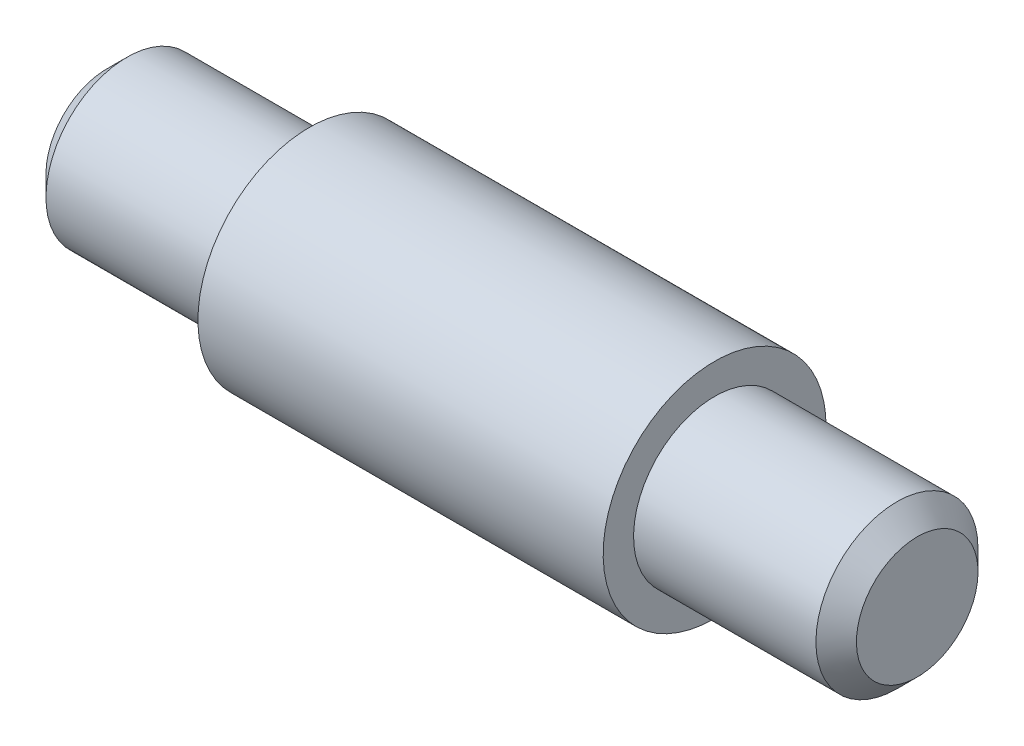
ISO-10303-21;
HEADER;
FILE_DESCRIPTION(('STEP AP214'),'2;1');
FILE_NAME('part.step','',(''),(''),'','','');
FILE_SCHEMA(('AUTOMOTIVE_DESIGN { 1 0 10303 214 1 1 1 1 }'));
ENDSEC;
DATA;
#1=APPLICATION_CONTEXT('core data for automotive mechanical design processes');
#2=APPLICATION_PROTOCOL_DEFINITION('international standard','automotive_design',2000,#1);
#3=PRODUCT_CONTEXT('',#1,'mechanical');
#4=PRODUCT('Part','Part','',(#3));
#5=PRODUCT_RELATED_PRODUCT_CATEGORY('part','',(#4));
#6=PRODUCT_DEFINITION_FORMATION('','',#4);
#7=PRODUCT_DEFINITION_CONTEXT('part definition',#1,'design');
#8=PRODUCT_DEFINITION('design','',#6,#7);
#9=PRODUCT_DEFINITION_SHAPE('','',#8);
#10=(LENGTH_UNIT() NAMED_UNIT(*) SI_UNIT(.MILLI.,.METRE.));
#11=(NAMED_UNIT(*) PLANE_ANGLE_UNIT() SI_UNIT($,.RADIAN.));
#12=(NAMED_UNIT(*) SI_UNIT($,.STERADIAN.) SOLID_ANGLE_UNIT());
#13=UNCERTAINTY_MEASURE_WITH_UNIT(LENGTH_MEASURE(1.E-05),#10,'distance_accuracy_value','');
#14=(GEOMETRIC_REPRESENTATION_CONTEXT(3) GLOBAL_UNCERTAINTY_ASSIGNED_CONTEXT((#13)) GLOBAL_UNIT_ASSIGNED_CONTEXT((#10,
#11,#12)) REPRESENTATION_CONTEXT('',''));
#15=CARTESIAN_POINT('',(0.,0.,0.));
#16=DIRECTION('',(0.,0.,1.));
#17=DIRECTION('',(1.,0.,0.));
#18=AXIS2_PLACEMENT_3D('',#15,#16,#17);
#19=CARTESIAN_POINT('',(39.9999999999997,0.,0.));
#20=DIRECTION('',(1.,0.,0.));
#21=DIRECTION('',(0.,1.,0.));
#22=AXIS2_PLACEMENT_3D('',#19,#20,#21);
#23=PLANE('',#22);
#24=CARTESIAN_POINT('',(39.9999999999997,0.,0.));
#25=DIRECTION('',(1.,0.,0.));
#26=DIRECTION('',(0.,1.,0.));
#27=AXIS2_PLACEMENT_3D('',#24,#25,#26);
#28=CIRCLE('',#27,5.99999999999995);
#29=CARTESIAN_POINT('',(39.9999999999997,5.99999999999998,0.));
#30=VERTEX_POINT('',#29);
#31=EDGE_CURVE('E44',#30,#30,#28,.T.);
#32=ORIENTED_EDGE('',*,*,#31,.T.);
#33=EDGE_LOOP('',(#32));
#34=FACE_BOUND('',#33,.T.);
#35=ADVANCED_FACE('F32',(#34),#23,.T.);
#36=CARTESIAN_POINT('',(-50.0000000000003,0.,0.));
#37=DIRECTION('',(-1.,0.,0.));
#38=DIRECTION('',(0.,-1.,0.));
#39=AXIS2_PLACEMENT_3D('',#36,#37,#38);
#40=CYLINDRICAL_SURFACE('',#39,8.00000000000001);
#41=CARTESIAN_POINT('',(37.9999999999997,0.,0.));
#42=DIRECTION('',(1.,0.,0.));
#43=DIRECTION('',(0.,1.,0.));
#44=AXIS2_PLACEMENT_3D('',#41,#42,#43);
#45=CIRCLE('',#44,8.00000000000001);
#46=CARTESIAN_POINT('',(37.9999999999997,8.00000000000003,0.));
#47=VERTEX_POINT('',#46);
#48=EDGE_CURVE('E48',#47,#47,#45,.F.);
#49=ORIENTED_EDGE('',*,*,#48,.T.);
#50=EDGE_LOOP('',(#49));
#51=FACE_BOUND('',#50,.T.);
#52=CARTESIAN_POINT('',(20.,-1.2490009027033E-13,0.));
#53=DIRECTION('',(-1.,0.,0.));
#54=DIRECTION('',(0.,-1.,0.));
#55=AXIS2_PLACEMENT_3D('',#52,#53,#54);
#56=CIRCLE('',#55,8.00000000000001);
#57=CARTESIAN_POINT('',(20.,-8.00000000000014,0.));
#58=VERTEX_POINT('',#57);
#59=EDGE_CURVE('E53',#58,#58,#56,.T.);
#60=ORIENTED_EDGE('',*,*,#59,.F.);
#61=EDGE_LOOP('',(#60));
#62=FACE_BOUND('',#61,.T.);
#63=ADVANCED_FACE('F83',(#51,#62),#40,.T.);
#64=CARTESIAN_POINT('',(20.,-7.99999999999999,0.));
#65=DIRECTION('',(1.,0.,0.));
#66=DIRECTION('',(0.,1.,0.));
#67=AXIS2_PLACEMENT_3D('',#64,#65,#66);
#68=PLANE('',#67);
#69=ORIENTED_EDGE('',*,*,#59,.T.);
#70=EDGE_LOOP('',(#69));
#71=FACE_BOUND('',#70,.T.);
#72=CARTESIAN_POINT('',(20.,-1.2490009027033E-13,0.));
#73=DIRECTION('',(-1.,0.,0.));
#74=DIRECTION('',(0.,-1.,0.));
#75=AXIS2_PLACEMENT_3D('',#72,#73,#74);
#76=CIRCLE('',#75,11.);
#77=CARTESIAN_POINT('',(20.,-11.0000000000001,0.));
#78=VERTEX_POINT('',#77);
#79=EDGE_CURVE('E56',#78,#78,#76,.T.);
#80=ORIENTED_EDGE('',*,*,#79,.F.);
#81=EDGE_LOOP('',(#80));
#82=FACE_BOUND('',#81,.T.);
#83=ADVANCED_FACE('F79',(#71,#82),#68,.T.);
#84=CARTESIAN_POINT('',(-50.0000000000003,0.,0.));
#85=DIRECTION('',(-1.,0.,0.));
#86=DIRECTION('',(0.,-1.,0.));
#87=AXIS2_PLACEMENT_3D('',#84,#85,#86);
#88=CYLINDRICAL_SURFACE('',#87,11.);
#89=ORIENTED_EDGE('',*,*,#79,.T.);
#90=EDGE_LOOP('',(#89));
#91=FACE_BOUND('',#90,.T.);
#92=CARTESIAN_POINT('',(-20.,3.19189119579733E-13,0.));
#93=DIRECTION('',(-1.,0.,0.));
#94=DIRECTION('',(0.,-1.,0.));
#95=AXIS2_PLACEMENT_3D('',#92,#93,#94);
#96=CIRCLE('',#95,11.);
#97=CARTESIAN_POINT('',(-20.,-10.9999999999997,0.));
#98=VERTEX_POINT('',#97);
#99=EDGE_CURVE('E59',#98,#98,#96,.T.);
#100=ORIENTED_EDGE('',*,*,#99,.F.);
#101=EDGE_LOOP('',(#100));
#102=FACE_BOUND('',#101,.T.);
#103=ADVANCED_FACE('F70',(#91,#102),#88,.T.);
#104=CARTESIAN_POINT('',(-20.,-11.,0.));
#105=DIRECTION('',(-1.,0.,0.));
#106=DIRECTION('',(0.,-1.,0.));
#107=AXIS2_PLACEMENT_3D('',#104,#105,#106);
#108=PLANE('',#107);
#109=ORIENTED_EDGE('',*,*,#99,.T.);
#110=EDGE_LOOP('',(#109));
#111=FACE_BOUND('',#110,.T.);
#112=CARTESIAN_POINT('',(-20.,3.19189119579733E-13,0.));
#113=DIRECTION('',(-1.,0.,0.));
#114=DIRECTION('',(0.,-1.,0.));
#115=AXIS2_PLACEMENT_3D('',#112,#113,#114);
#116=CIRCLE('',#115,8.);
#117=CARTESIAN_POINT('',(-20.,-7.99999999999969,0.));
#118=VERTEX_POINT('',#117);
#119=EDGE_CURVE('E62',#118,#118,#116,.T.);
#120=ORIENTED_EDGE('',*,*,#119,.F.);
#121=EDGE_LOOP('',(#120));
#122=FACE_BOUND('',#121,.T.);
#123=ADVANCED_FACE('F68',(#111,#122),#108,.T.);
#124=CARTESIAN_POINT('',(-50.0000000000003,0.,0.));
#125=DIRECTION('',(-1.,0.,0.));
#126=DIRECTION('',(0.,-1.,0.));
#127=AXIS2_PLACEMENT_3D('',#124,#125,#126);
#128=CYLINDRICAL_SURFACE('',#127,8.);
#129=CARTESIAN_POINT('',(-38.0000000000003,0.,0.));
#130=DIRECTION('',(-1.,0.,0.));
#131=DIRECTION('',(0.,-1.,0.));
#132=AXIS2_PLACEMENT_3D('',#129,#130,#131);
#133=CIRCLE('',#132,8.);
#134=CARTESIAN_POINT('',(-38.0000000000003,-8.00000000000001,0.));
#135=VERTEX_POINT('',#134);
#136=EDGE_CURVE('E10',#135,#135,#133,.F.);
#137=ORIENTED_EDGE('',*,*,#136,.T.);
#138=EDGE_LOOP('',(#137));
#139=FACE_BOUND('',#138,.T.);
#140=ORIENTED_EDGE('',*,*,#119,.T.);
#141=EDGE_LOOP('',(#140));
#142=FACE_BOUND('',#141,.T.);
#143=ADVANCED_FACE('F66',(#139,#142),#128,.T.);
#144=CARTESIAN_POINT('',(-40.,-7.99999999999994,0.));
#145=DIRECTION('',(-1.,0.,0.));
#146=DIRECTION('',(0.,-1.,0.));
#147=AXIS2_PLACEMENT_3D('',#144,#145,#146);
#148=PLANE('',#147);
#149=CARTESIAN_POINT('',(-40.0000000000003,0.,0.));
#150=DIRECTION('',(-1.,0.,0.));
#151=DIRECTION('',(0.,-1.,0.));
#152=AXIS2_PLACEMENT_3D('',#149,#150,#151);
#153=CIRCLE('',#152,6.00000000000003);
#154=CARTESIAN_POINT('',(-40.0000000000003,-6.00000000000003,0.));
#155=VERTEX_POINT('',#154);
#156=EDGE_CURVE('E40',#155,#155,#153,.T.);
#157=ORIENTED_EDGE('',*,*,#156,.T.);
#158=EDGE_LOOP('',(#157));
#159=FACE_BOUND('',#158,.T.);
#160=ADVANCED_FACE('F77',(#159),#148,.T.);
#161=CARTESIAN_POINT('',(37.9999999999997,0.,0.));
#162=DIRECTION('',(-1.,0.,0.));
#163=DIRECTION('',(0.,-1.,0.));
#164=AXIS2_PLACEMENT_3D('',#161,#162,#163);
#165=CONICAL_SURFACE('',#164,8.00000000000001,0.78539816339745);
#166=ORIENTED_EDGE('',*,*,#31,.F.);
#167=EDGE_LOOP('',(#166));
#168=FACE_BOUND('',#167,.T.);
#169=ORIENTED_EDGE('',*,*,#48,.F.);
#170=EDGE_LOOP('',(#169));
#171=FACE_BOUND('',#170,.T.);
#172=ADVANCED_FACE('F93',(#168,#171),#165,.T.);
#173=CARTESIAN_POINT('',(-40.0000000000003,0.,0.));
#174=DIRECTION('',(1.,0.,0.));
#175=DIRECTION('',(0.,1.,0.));
#176=AXIS2_PLACEMENT_3D('',#173,#174,#175);
#177=CONICAL_SURFACE('',#176,6.00000000000003,0.785398163397446);
#178=ORIENTED_EDGE('',*,*,#136,.F.);
#179=EDGE_LOOP('',(#178));
#180=FACE_BOUND('',#179,.T.);
#181=ORIENTED_EDGE('',*,*,#156,.F.);
#182=EDGE_LOOP('',(#181));
#183=FACE_BOUND('',#182,.T.);
#184=ADVANCED_FACE('F35',(#180,#183),#177,.T.);
#185=CLOSED_SHELL('',(#35,#63,#83,#103,#123,#143,#160,#172,#184));
#186=MANIFOLD_SOLID_BREP('B2',#185);
#187=ADVANCED_BREP_SHAPE_REPRESENTATION('',(#18,#186),#14);
#188=SHAPE_DEFINITION_REPRESENTATION(#9,#187);
ENDSEC;
END-ISO-10303-21;
